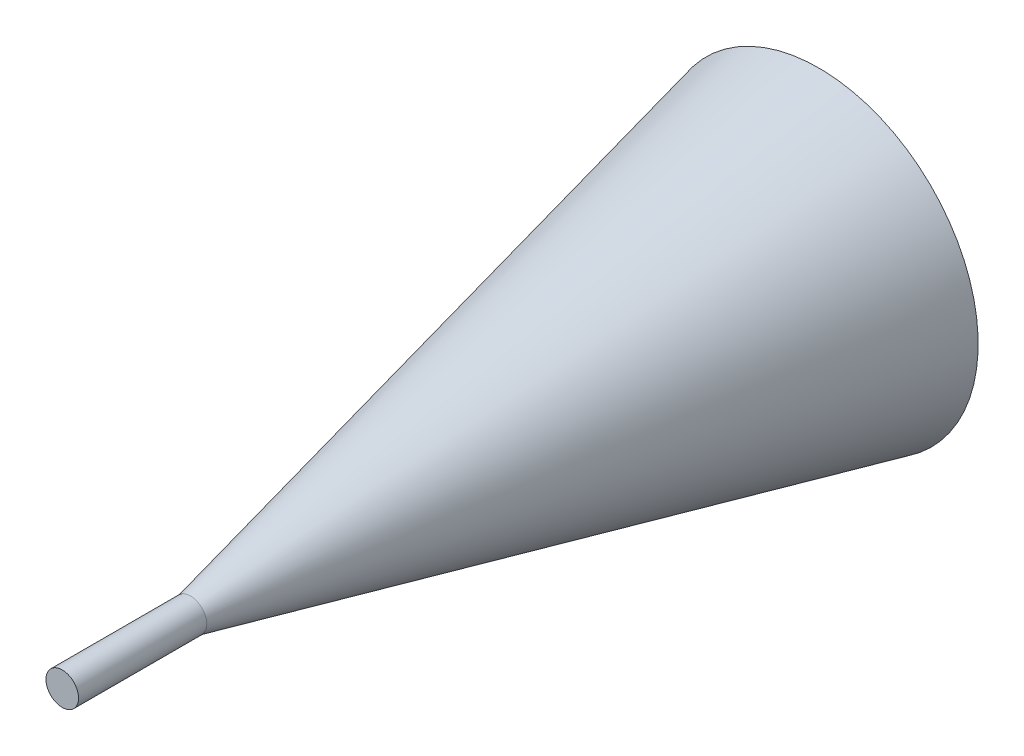
ISO-10303-21;
HEADER;
FILE_DESCRIPTION(('STEP AP214'),'2;1');
FILE_NAME('part.step','',(''),(''),'','','');
FILE_SCHEMA(('AUTOMOTIVE_DESIGN { 1 0 10303 214 1 1 1 1 }'));
ENDSEC;
DATA;
#1=APPLICATION_CONTEXT('core data for automotive mechanical design processes');
#2=APPLICATION_PROTOCOL_DEFINITION('international standard','automotive_design',2000,#1);
#3=PRODUCT_CONTEXT('',#1,'mechanical');
#4=PRODUCT('Part','Part','',(#3));
#5=PRODUCT_RELATED_PRODUCT_CATEGORY('part','',(#4));
#6=PRODUCT_DEFINITION_FORMATION('','',#4);
#7=PRODUCT_DEFINITION_CONTEXT('part definition',#1,'design');
#8=PRODUCT_DEFINITION('design','',#6,#7);
#9=PRODUCT_DEFINITION_SHAPE('','',#8);
#10=(LENGTH_UNIT() NAMED_UNIT(*) SI_UNIT(.MILLI.,.METRE.));
#11=(NAMED_UNIT(*) PLANE_ANGLE_UNIT() SI_UNIT($,.RADIAN.));
#12=(NAMED_UNIT(*) SI_UNIT($,.STERADIAN.) SOLID_ANGLE_UNIT());
#13=UNCERTAINTY_MEASURE_WITH_UNIT(LENGTH_MEASURE(1.E-05),#10,'distance_accuracy_value','');
#14=(GEOMETRIC_REPRESENTATION_CONTEXT(3) GLOBAL_UNCERTAINTY_ASSIGNED_CONTEXT((#13)) GLOBAL_UNIT_ASSIGNED_CONTEXT((#10,
#11,#12)) REPRESENTATION_CONTEXT('',''));
#15=CARTESIAN_POINT('',(0.,0.,0.));
#16=DIRECTION('',(0.,0.,1.));
#17=DIRECTION('',(1.,0.,0.));
#18=AXIS2_PLACEMENT_3D('',#15,#16,#17);
#19=CARTESIAN_POINT('',(0.,0.,53.7625));
#20=DIRECTION('',(0.,0.,-1.));
#21=DIRECTION('',(-1.,0.,0.));
#22=AXIS2_PLACEMENT_3D('',#19,#20,#21);
#23=CONICAL_SURFACE('',#22,1.245,0.224323236444123);
#24=CARTESIAN_POINT('',(0.,0.,4.7625));
#25=DIRECTION('',(0.,0.,1.));
#26=DIRECTION('',(1.,0.,0.));
#27=AXIS2_PLACEMENT_3D('',#24,#25,#26);
#28=CIRCLE('',#27,12.425);
#29=CARTESIAN_POINT('',(-12.425,0.,4.7625));
#30=VERTEX_POINT('',#29);
#31=EDGE_CURVE('E54',#30,#30,#28,.F.);
#32=CARTESIAN_POINT('',(0.,0.,53.7625));
#33=DIRECTION('',(0.,0.,1.));
#34=DIRECTION('',(1.,0.,0.));
#35=AXIS2_PLACEMENT_3D('',#32,#33,#34);
#36=CIRCLE('',#35,1.245);
#37=CARTESIAN_POINT('',(-1.245,0.,53.7625));
#38=VERTEX_POINT('',#37);
#39=EDGE_CURVE('E10',#38,#38,#36,.T.);
#40=CARTESIAN_POINT('',(-12.425,0.,4.7625));
#41=CARTESIAN_POINT('',(-12.3085416666667,0.,5.27291666666667));
#42=CARTESIAN_POINT('',(-12.1920833333333,0.,5.78333333333333));
#43=CARTESIAN_POINT('',(-11.9591666666667,0.,6.80416666666667));
#44=CARTESIAN_POINT('',(-11.8427083333333,0.,7.31458333333334));
#45=CARTESIAN_POINT('',(-11.6097916666667,0.,8.33541666666667));
#46=CARTESIAN_POINT('',(-11.4933333333333,0.,8.84583333333334));
#47=CARTESIAN_POINT('',(-11.2604166666667,0.,9.86666666666667));
#48=CARTESIAN_POINT('',(-11.1439583333333,0.,10.3770833333333));
#49=CARTESIAN_POINT('',(-10.9110416666667,0.,11.3979166666667));
#50=CARTESIAN_POINT('',(-10.7945833333333,0.,11.9083333333333));
#51=CARTESIAN_POINT('',(-10.5616666666667,0.,12.9291666666667));
#52=CARTESIAN_POINT('',(-10.4452083333333,0.,13.4395833333333));
#53=CARTESIAN_POINT('',(-10.2122916666667,0.,14.4604166666667));
#54=CARTESIAN_POINT('',(-10.0958333333333,0.,14.9708333333333));
#55=CARTESIAN_POINT('',(-9.86291666666667,0.,15.9916666666667));
#56=CARTESIAN_POINT('',(-9.74645833333334,0.,16.5020833333333));
#57=CARTESIAN_POINT('',(-9.51354166666667,0.,17.5229166666667));
#58=CARTESIAN_POINT('',(-9.39708333333334,0.,18.0333333333333));
#59=CARTESIAN_POINT('',(-9.16416666666667,0.,19.0541666666667));
#60=CARTESIAN_POINT('',(-9.04770833333334,0.,19.5645833333333));
#61=CARTESIAN_POINT('',(-8.81479166666667,0.,20.5854166666667));
#62=CARTESIAN_POINT('',(-8.69833333333334,0.,21.0958333333333));
#63=CARTESIAN_POINT('',(-8.46541666666667,0.,22.1166666666667));
#64=CARTESIAN_POINT('',(-8.34895833333334,0.,22.6270833333333));
#65=CARTESIAN_POINT('',(-8.11604166666667,0.,23.6479166666667));
#66=CARTESIAN_POINT('',(-7.99958333333334,0.,24.1583333333333));
#67=CARTESIAN_POINT('',(-7.76666666666667,0.,25.1791666666667));
#68=CARTESIAN_POINT('',(-7.65020833333334,0.,25.6895833333333));
#69=CARTESIAN_POINT('',(-7.41729166666667,0.,26.7104166666667));
#70=CARTESIAN_POINT('',(-7.30083333333334,0.,27.2208333333333));
#71=CARTESIAN_POINT('',(-7.06791666666667,0.,28.2416666666667));
#72=CARTESIAN_POINT('',(-6.95145833333334,0.,28.7520833333333));
#73=CARTESIAN_POINT('',(-6.71854166666667,0.,29.7729166666667));
#74=CARTESIAN_POINT('',(-6.60208333333334,0.,30.2833333333333));
#75=CARTESIAN_POINT('',(-6.36916666666667,0.,31.3041666666667));
#76=CARTESIAN_POINT('',(-6.25270833333334,0.,31.8145833333333));
#77=CARTESIAN_POINT('',(-6.01979166666667,0.,32.8354166666667));
#78=CARTESIAN_POINT('',(-5.90333333333334,0.,33.3458333333333));
#79=CARTESIAN_POINT('',(-5.67041666666667,0.,34.3666666666667));
#80=CARTESIAN_POINT('',(-5.55395833333333,0.,34.8770833333333));
#81=CARTESIAN_POINT('',(-5.32104166666667,0.,35.8979166666667));
#82=CARTESIAN_POINT('',(-5.20458333333333,0.,36.4083333333333));
#83=CARTESIAN_POINT('',(-4.97166666666667,0.,37.4291666666667));
#84=CARTESIAN_POINT('',(-4.85520833333333,0.,37.9395833333333));
#85=CARTESIAN_POINT('',(-4.62229166666667,0.,38.9604166666667));
#86=CARTESIAN_POINT('',(-4.50583333333334,0.,39.4708333333333));
#87=CARTESIAN_POINT('',(-4.27291666666667,0.,40.4916666666667));
#88=CARTESIAN_POINT('',(-4.15645833333333,0.,41.0020833333333));
#89=CARTESIAN_POINT('',(-3.92354166666667,0.,42.0229166666667));
#90=CARTESIAN_POINT('',(-3.80708333333333,0.,42.5333333333333));
#91=CARTESIAN_POINT('',(-3.57416666666667,0.,43.5541666666667));
#92=CARTESIAN_POINT('',(-3.45770833333333,0.,44.0645833333333));
#93=CARTESIAN_POINT('',(-3.22479166666667,0.,45.0854166666667));
#94=CARTESIAN_POINT('',(-3.10833333333333,0.,45.5958333333333));
#95=CARTESIAN_POINT('',(-2.87541666666667,0.,46.6166666666667));
#96=CARTESIAN_POINT('',(-2.75895833333333,0.,47.1270833333333));
#97=CARTESIAN_POINT('',(-2.52604166666667,0.,48.1479166666667));
#98=CARTESIAN_POINT('',(-2.40958333333333,0.,48.6583333333333));
#99=CARTESIAN_POINT('',(-2.17666666666667,0.,49.6791666666667));
#100=CARTESIAN_POINT('',(-2.06020833333333,0.,50.1895833333333));
#101=CARTESIAN_POINT('',(-1.82729166666667,0.,51.2104166666667));
#102=CARTESIAN_POINT('',(-1.71083333333333,0.,51.7208333333333));
#103=CARTESIAN_POINT('',(-1.47791666666667,0.,52.7416666666667));
#104=CARTESIAN_POINT('',(-1.36145833333333,0.,53.2520833333333));
#105=CARTESIAN_POINT('',(-1.245,0.,53.7625));
#106=B_SPLINE_CURVE_WITH_KNOTS('',3,(#40,#41,#42,#43,#44,#45,#46,#47,#48,#49,#50,#51,#52,#53,
#54,#55,#56,#57,#58,#59,#60,#61,#62,#63,#64,#65,#66,#67,#68,#69,#70,#71,#72,#73,#74,#75,#76,#77,
#78,#79,#80,#81,#82,#83,#84,#85,#86,#87,#88,#89,#90,#91,#92,#93,#94,#95,#96,#97,#98,#99,#100,
#101,#102,#103,#104,#105),.UNSPECIFIED.,.F.,.F.,(4,2,2,2,2,2,2,2,2,2,2,2,2,2,2,2,2,2,2,2,2,2,2,
2,2,2,2,2,2,2,2,2,4),(0.,1.57060162139385,3.14120324278771,4.71180486418156,6.28240648557541,
7.85300810696927,9.42360972836312,10.994211349757,12.5648129711508,14.1354145925447,
15.7060162139385,17.2766178353324,18.8472194567262,20.4178210781201,21.9884226995139,
23.5590243209078,25.1296259423017,26.7002275636955,28.2708291850894,29.8414308064832,
31.4120324278771,32.9826340492709,34.5532356706648,36.1238372920586,37.6944389134525,
39.2650405348463,40.8356421562402,42.406243777634,43.9768453990279,45.5474470204217,
47.1180486418156,48.6886502632094,50.2592518846033),.UNSPECIFIED.);
#107=EDGE_CURVE('BSEAM39',#30,#38,#106,.T.);
#108=ORIENTED_EDGE('',*,*,#31,.F.);
#109=ORIENTED_EDGE('',*,*,#39,.F.);
#110=ORIENTED_EDGE('',*,*,#107,.T.);
#111=ORIENTED_EDGE('',*,*,#107,.F.);
#112=EDGE_LOOP('',(#108,#110,#109,#111));
#113=FACE_BOUND('',#112,.T.);
#114=ADVANCED_FACE('F39',(#113),#23,.T.);
#115=CARTESIAN_POINT('',(0.,0.,63.7625));
#116=DIRECTION('',(0.,0.,-1.));
#117=DIRECTION('',(-1.,0.,0.));
#118=AXIS2_PLACEMENT_3D('',#115,#116,#117);
#119=CYLINDRICAL_SURFACE('',#118,1.27);
#120=CARTESIAN_POINT('',(0.,0.,63.7625));
#121=DIRECTION('',(0.,0.,1.));
#122=DIRECTION('',(1.,0.,0.));
#123=AXIS2_PLACEMENT_3D('',#120,#121,#122);
#124=CIRCLE('',#123,1.27);
#125=CARTESIAN_POINT('',(1.27,0.,63.7625));
#126=VERTEX_POINT('',#125);
#127=EDGE_CURVE('E45',#126,#126,#124,.T.);
#128=ORIENTED_EDGE('',*,*,#127,.F.);
#129=EDGE_LOOP('',(#128));
#130=FACE_BOUND('',#129,.T.);
#131=CARTESIAN_POINT('',(0.,0.,53.7625));
#132=DIRECTION('',(0.,0.,1.));
#133=DIRECTION('',(1.,0.,0.));
#134=AXIS2_PLACEMENT_3D('',#131,#132,#133);
#135=CIRCLE('',#134,1.27);
#136=CARTESIAN_POINT('',(1.27,0.,53.7625));
#137=VERTEX_POINT('',#136);
#138=EDGE_CURVE('E49',#137,#137,#135,.T.);
#139=ORIENTED_EDGE('',*,*,#138,.T.);
#140=EDGE_LOOP('',(#139));
#141=FACE_BOUND('',#140,.T.);
#142=ADVANCED_FACE('F82',(#130,#141),#119,.T.);
#143=CARTESIAN_POINT('',(0.,0.,63.7625));
#144=DIRECTION('',(0.,0.,1.));
#145=DIRECTION('',(1.,0.,0.));
#146=AXIS2_PLACEMENT_3D('',#143,#144,#145);
#147=PLANE('',#146);
#148=ORIENTED_EDGE('',*,*,#127,.T.);
#149=EDGE_LOOP('',(#148));
#150=FACE_BOUND('',#149,.T.);
#151=ADVANCED_FACE('F86',(#150),#147,.T.);
#152=CARTESIAN_POINT('',(0.,0.,53.7625));
#153=DIRECTION('',(0.,0.,1.));
#154=DIRECTION('',(1.,0.,0.));
#155=AXIS2_PLACEMENT_3D('',#152,#153,#154);
#156=PLANE('',#155);
#157=ORIENTED_EDGE('',*,*,#39,.T.);
#158=EDGE_LOOP('',(#157));
#159=FACE_BOUND('',#158,.T.);
#160=ORIENTED_EDGE('',*,*,#138,.F.);
#161=EDGE_LOOP('',(#160));
#162=FACE_BOUND('',#161,.T.);
#163=ADVANCED_FACE('F76',(#159,#162),#156,.F.);
#164=CARTESIAN_POINT('',(0.,0.,4.7625));
#165=DIRECTION('',(0.,0.,1.));
#166=DIRECTION('',(1.,0.,0.));
#167=AXIS2_PLACEMENT_3D('',#164,#165,#166);
#168=PLANE('',#167);
#169=CARTESIAN_POINT('',(0.,0.,4.7625));
#170=DIRECTION('',(0.,0.,-1.));
#171=DIRECTION('',(-1.,0.,0.));
#172=AXIS2_PLACEMENT_3D('',#169,#170,#171);
#173=CIRCLE('',#172,2.667);
#174=CARTESIAN_POINT('',(-2.667,0.,4.7625));
#175=VERTEX_POINT('',#174);
#176=EDGE_CURVE('E59',#175,#175,#173,.T.);
#177=ORIENTED_EDGE('',*,*,#176,.F.);
#178=EDGE_LOOP('',(#177));
#179=FACE_BOUND('',#178,.T.);
#180=ORIENTED_EDGE('',*,*,#31,.T.);
#181=EDGE_LOOP('',(#180));
#182=FACE_BOUND('',#181,.T.);
#183=ADVANCED_FACE('F70',(#179,#182),#168,.F.);
#184=CARTESIAN_POINT('',(0.,0.,14.7625));
#185=DIRECTION('',(0.,0.,-1.));
#186=DIRECTION('',(-1.,0.,0.));
#187=AXIS2_PLACEMENT_3D('',#184,#185,#186);
#188=CYLINDRICAL_SURFACE('',#187,2.667);
#189=CARTESIAN_POINT('',(0.,0.,14.7625));
#190=DIRECTION('',(0.,0.,-1.));
#191=DIRECTION('',(-1.,0.,0.));
#192=AXIS2_PLACEMENT_3D('',#189,#190,#191);
#193=CIRCLE('',#192,2.667);
#194=CARTESIAN_POINT('',(-2.667,0.,14.7625));
#195=VERTEX_POINT('',#194);
#196=EDGE_CURVE('E58',#195,#195,#193,.T.);
#197=ORIENTED_EDGE('',*,*,#196,.F.);
#198=EDGE_LOOP('',(#197));
#199=FACE_BOUND('',#198,.T.);
#200=ORIENTED_EDGE('',*,*,#176,.T.);
#201=EDGE_LOOP('',(#200));
#202=FACE_BOUND('',#201,.T.);
#203=ADVANCED_FACE('F67',(#199,#202),#188,.F.);
#204=CARTESIAN_POINT('',(0.,0.,14.7625));
#205=DIRECTION('',(0.,0.,-1.));
#206=DIRECTION('',(-1.,0.,0.));
#207=AXIS2_PLACEMENT_3D('',#204,#205,#206);
#208=PLANE('',#207);
#209=ORIENTED_EDGE('',*,*,#196,.T.);
#210=EDGE_LOOP('',(#209));
#211=FACE_BOUND('',#210,.T.);
#212=ADVANCED_FACE('F65',(#211),#208,.T.);
#213=CLOSED_SHELL('',(#114,#142,#151,#163,#183,#203,#212));
#214=MANIFOLD_SOLID_BREP('B2',#213);
#215=ADVANCED_BREP_SHAPE_REPRESENTATION('',(#18,#214),#14);
#216=SHAPE_DEFINITION_REPRESENTATION(#9,#215);
ENDSEC;
END-ISO-10303-21;
